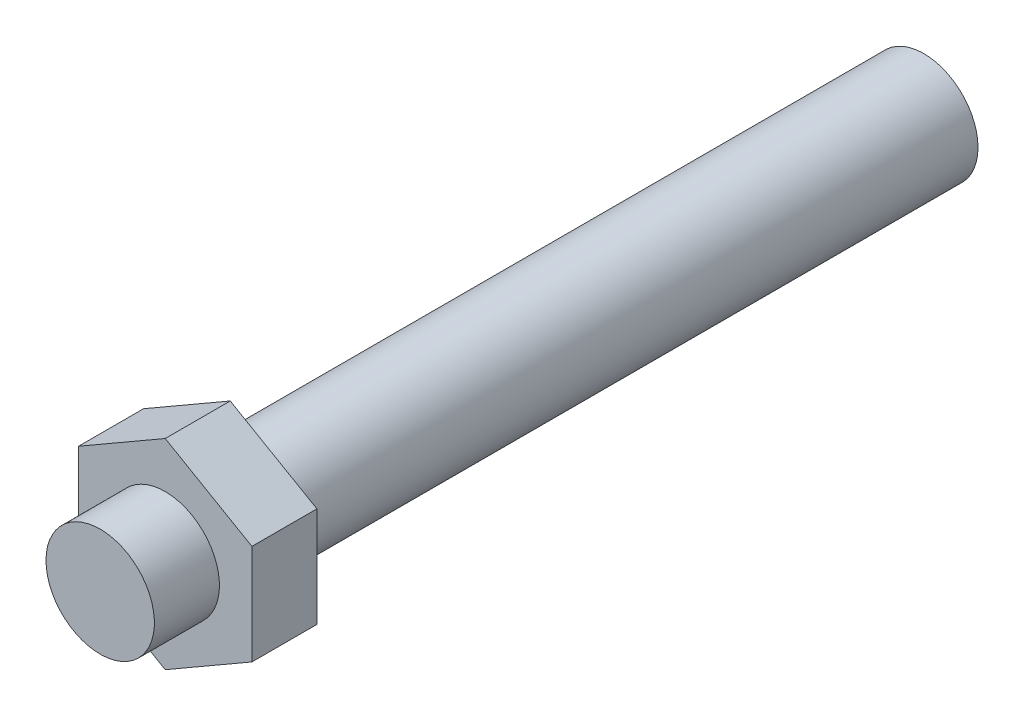
ISO-10303-21;
HEADER;
FILE_DESCRIPTION(('STEP AP214'),'2;1');
FILE_NAME('part.step','',(''),(''),'','','');
FILE_SCHEMA(('AUTOMOTIVE_DESIGN { 1 0 10303 214 1 1 1 1 }'));
ENDSEC;
DATA;
#1=APPLICATION_CONTEXT('core data for automotive mechanical design processes');
#2=APPLICATION_PROTOCOL_DEFINITION('international standard','automotive_design',2000,#1);
#3=PRODUCT_CONTEXT('',#1,'mechanical');
#4=PRODUCT('Part','Part','',(#3));
#5=PRODUCT_RELATED_PRODUCT_CATEGORY('part','',(#4));
#6=PRODUCT_DEFINITION_FORMATION('','',#4);
#7=PRODUCT_DEFINITION_CONTEXT('part definition',#1,'design');
#8=PRODUCT_DEFINITION('design','',#6,#7);
#9=PRODUCT_DEFINITION_SHAPE('','',#8);
#10=(LENGTH_UNIT() NAMED_UNIT(*) SI_UNIT(.MILLI.,.METRE.));
#11=(NAMED_UNIT(*) PLANE_ANGLE_UNIT() SI_UNIT($,.RADIAN.));
#12=(NAMED_UNIT(*) SI_UNIT($,.STERADIAN.) SOLID_ANGLE_UNIT());
#13=UNCERTAINTY_MEASURE_WITH_UNIT(LENGTH_MEASURE(1.E-05),#10,'distance_accuracy_value','');
#14=(GEOMETRIC_REPRESENTATION_CONTEXT(3) GLOBAL_UNCERTAINTY_ASSIGNED_CONTEXT((#13)) GLOBAL_UNIT_ASSIGNED_CONTEXT((#10,
#11,#12)) REPRESENTATION_CONTEXT('',''));
#15=CARTESIAN_POINT('',(0.,0.,0.));
#16=DIRECTION('',(0.,0.,1.));
#17=DIRECTION('',(1.,0.,0.));
#18=AXIS2_PLACEMENT_3D('',#15,#16,#17);
#19=CARTESIAN_POINT('',(12.7,-7.33234841870825,111.125));
#20=DIRECTION('',(0.,0.,1.));
#21=DIRECTION('',(1.,0.,0.));
#22=AXIS2_PLACEMENT_3D('',#19,#20,#21);
#23=PLANE('',#22);
#24=DIRECTION('',(0.866025403784439,0.5,0.));
#25=VECTOR('',#24,1.);
#26=CARTESIAN_POINT('',(0.,-14.6646968374165,111.125));
#27=LINE('',#26,#25);
#28=CARTESIAN_POINT('',(0.,-14.6646968374165,111.125));
#29=VERTEX_POINT('',#28);
#30=CARTESIAN_POINT('',(12.7,-7.33234841870825,111.125));
#31=VERTEX_POINT('',#30);
#32=EDGE_CURVE('E125',#29,#31,#27,.T.);
#33=ORIENTED_EDGE('',*,*,#32,.T.);
#34=DIRECTION('',(0.,1.,0.));
#35=VECTOR('',#34,1.);
#36=CARTESIAN_POINT('',(12.7,-7.33234841870825,111.125));
#37=LINE('',#36,#35);
#38=CARTESIAN_POINT('',(12.7,7.33234841870825,111.125));
#39=VERTEX_POINT('',#38);
#40=EDGE_CURVE('E103',#31,#39,#37,.T.);
#41=ORIENTED_EDGE('',*,*,#40,.T.);
#42=DIRECTION('',(-0.866025403784439,0.5,0.));
#43=VECTOR('',#42,1.);
#44=CARTESIAN_POINT('',(12.7,7.33234841870825,111.125));
#45=LINE('',#44,#43);
#46=CARTESIAN_POINT('',(0.,14.6646968374165,111.125));
#47=VERTEX_POINT('',#46);
#48=EDGE_CURVE('E128',#39,#47,#45,.T.);
#49=ORIENTED_EDGE('',*,*,#48,.T.);
#50=DIRECTION('',(-0.866025403784438,-0.5,0.));
#51=VECTOR('',#50,1.);
#52=CARTESIAN_POINT('',(0.,14.6646968374165,111.125));
#53=LINE('',#52,#51);
#54=CARTESIAN_POINT('',(-12.7,7.33234841870825,111.125));
#55=VERTEX_POINT('',#54);
#56=EDGE_CURVE('E130',#47,#55,#53,.T.);
#57=ORIENTED_EDGE('',*,*,#56,.T.);
#58=DIRECTION('',(0.,-1.,0.));
#59=VECTOR('',#58,1.);
#60=CARTESIAN_POINT('',(-12.7,7.33234841870825,111.125));
#61=LINE('',#60,#59);
#62=CARTESIAN_POINT('',(-12.7,-7.33234841870825,111.125));
#63=VERTEX_POINT('',#62);
#64=EDGE_CURVE('E54',#55,#63,#61,.T.);
#65=ORIENTED_EDGE('',*,*,#64,.T.);
#66=DIRECTION('',(0.866025403784439,-0.5,0.));
#67=VECTOR('',#66,1.);
#68=CARTESIAN_POINT('',(-12.7,-7.33234841870825,111.125));
#69=LINE('',#68,#67);
#70=EDGE_CURVE('E49',#63,#29,#69,.T.);
#71=ORIENTED_EDGE('',*,*,#70,.T.);
#72=EDGE_LOOP('',(#33,#41,#49,#57,#65,#71));
#73=FACE_BOUND('',#72,.T.);
#74=CARTESIAN_POINT('',(0.,0.,111.125));
#75=DIRECTION('',(0.,0.,1.));
#76=DIRECTION('',(1.,0.,0.));
#77=AXIS2_PLACEMENT_3D('',#74,#75,#76);
#78=CIRCLE('',#77,7.9375);
#79=CARTESIAN_POINT('',(-7.9375,0.,111.125));
#80=VERTEX_POINT('',#79);
#81=EDGE_CURVE('E114',#80,#80,#78,.T.);
#82=ORIENTED_EDGE('',*,*,#81,.F.);
#83=EDGE_LOOP('',(#82));
#84=FACE_BOUND('',#83,.T.);
#85=ADVANCED_FACE('F34',(#73,#84),#23,.T.);
#86=CARTESIAN_POINT('',(0.,0.,101.6));
#87=DIRECTION('',(0.,0.,-1.));
#88=DIRECTION('',(-1.,0.,0.));
#89=AXIS2_PLACEMENT_3D('',#86,#87,#88);
#90=CYLINDRICAL_SURFACE('',#89,7.9375);
#91=CARTESIAN_POINT('',(0.,0.,101.6));
#92=DIRECTION('',(0.,0.,1.));
#93=DIRECTION('',(1.,0.,0.));
#94=AXIS2_PLACEMENT_3D('',#91,#92,#93);
#95=CIRCLE('',#94,7.9375);
#96=CARTESIAN_POINT('',(7.9375,0.,101.6));
#97=VERTEX_POINT('',#96);
#98=EDGE_CURVE('E12',#97,#97,#95,.T.);
#99=ORIENTED_EDGE('',*,*,#98,.F.);
#100=EDGE_LOOP('',(#99));
#101=FACE_BOUND('',#100,.T.);
#102=CARTESIAN_POINT('',(0.,0.,0.));
#103=DIRECTION('',(0.,0.,1.));
#104=DIRECTION('',(1.,0.,0.));
#105=AXIS2_PLACEMENT_3D('',#102,#103,#104);
#106=CIRCLE('',#105,7.9375);
#107=CARTESIAN_POINT('',(7.9375,0.,0.));
#108=VERTEX_POINT('',#107);
#109=EDGE_CURVE('E42',#108,#108,#106,.T.);
#110=ORIENTED_EDGE('',*,*,#109,.T.);
#111=EDGE_LOOP('',(#110));
#112=FACE_BOUND('',#111,.T.);
#113=ADVANCED_FACE('F36',(#101,#112),#90,.T.);
#114=CARTESIAN_POINT('',(0.,0.,0.));
#115=DIRECTION('',(0.,0.,1.));
#116=DIRECTION('',(1.,0.,0.));
#117=AXIS2_PLACEMENT_3D('',#114,#115,#116);
#118=PLANE('',#117);
#119=ORIENTED_EDGE('',*,*,#109,.F.);
#120=EDGE_LOOP('',(#119));
#121=FACE_BOUND('',#120,.T.);
#122=ADVANCED_FACE('F148',(#121),#118,.F.);
#123=CARTESIAN_POINT('',(12.7,-7.33234841870825,101.6));
#124=DIRECTION('',(0.,0.,1.));
#125=DIRECTION('',(1.,0.,0.));
#126=AXIS2_PLACEMENT_3D('',#123,#124,#125);
#127=PLANE('',#126);
#128=DIRECTION('',(0.866025403784439,0.5,0.));
#129=VECTOR('',#128,1.);
#130=CARTESIAN_POINT('',(0.,-14.6646968374165,101.6));
#131=LINE('',#130,#129);
#132=CARTESIAN_POINT('',(0.,-14.6646968374165,101.6));
#133=VERTEX_POINT('',#132);
#134=CARTESIAN_POINT('',(12.7,-7.33234841870825,101.6));
#135=VERTEX_POINT('',#134);
#136=EDGE_CURVE('E93',#133,#135,#131,.T.);
#137=ORIENTED_EDGE('',*,*,#136,.F.);
#138=DIRECTION('',(0.866025403784439,-0.5,0.));
#139=VECTOR('',#138,1.);
#140=CARTESIAN_POINT('',(-12.7,-7.33234841870825,101.6));
#141=LINE('',#140,#139);
#142=CARTESIAN_POINT('',(-12.7,-7.33234841870825,101.6));
#143=VERTEX_POINT('',#142);
#144=EDGE_CURVE('E123',#143,#133,#141,.T.);
#145=ORIENTED_EDGE('',*,*,#144,.F.);
#146=DIRECTION('',(0.,-1.,0.));
#147=VECTOR('',#146,1.);
#148=CARTESIAN_POINT('',(-12.7,7.33234841870825,101.6));
#149=LINE('',#148,#147);
#150=CARTESIAN_POINT('',(-12.7,7.33234841870825,101.6));
#151=VERTEX_POINT('',#150);
#152=EDGE_CURVE('E121',#151,#143,#149,.T.);
#153=ORIENTED_EDGE('',*,*,#152,.F.);
#154=DIRECTION('',(-0.866025403784438,-0.5,0.));
#155=VECTOR('',#154,1.);
#156=CARTESIAN_POINT('',(0.,14.6646968374165,101.6));
#157=LINE('',#156,#155);
#158=CARTESIAN_POINT('',(0.,14.6646968374165,101.6));
#159=VERTEX_POINT('',#158);
#160=EDGE_CURVE('E119',#159,#151,#157,.T.);
#161=ORIENTED_EDGE('',*,*,#160,.F.);
#162=DIRECTION('',(-0.866025403784439,0.5,0.));
#163=VECTOR('',#162,1.);
#164=CARTESIAN_POINT('',(12.7,7.33234841870825,101.6));
#165=LINE('',#164,#163);
#166=CARTESIAN_POINT('',(12.7,7.33234841870825,101.6));
#167=VERTEX_POINT('',#166);
#168=EDGE_CURVE('E95',#167,#159,#165,.T.);
#169=ORIENTED_EDGE('',*,*,#168,.F.);
#170=DIRECTION('',(0.,1.,0.));
#171=VECTOR('',#170,1.);
#172=CARTESIAN_POINT('',(12.7,-7.33234841870825,101.6));
#173=LINE('',#172,#171);
#174=EDGE_CURVE('E87',#135,#167,#173,.T.);
#175=ORIENTED_EDGE('',*,*,#174,.F.);
#176=EDGE_LOOP('',(#137,#145,#153,#161,#169,#175));
#177=FACE_BOUND('',#176,.T.);
#178=ORIENTED_EDGE('',*,*,#98,.T.);
#179=EDGE_LOOP('',(#178));
#180=FACE_BOUND('',#179,.T.);
#181=ADVANCED_FACE('F89',(#177,#180),#127,.F.);
#182=CARTESIAN_POINT('',(0.,-14.6646968374165,111.125));
#183=DIRECTION('',(-0.5,0.866025403784439,0.));
#184=DIRECTION('',(-0.866025403784439,-0.5,0.));
#185=AXIS2_PLACEMENT_3D('',#182,#183,#184);
#186=PLANE('',#185);
#187=ORIENTED_EDGE('',*,*,#136,.T.);
#188=DIRECTION('',(0.,0.,-1.));
#189=VECTOR('',#188,1.);
#190=CARTESIAN_POINT('',(12.7,-7.33234841870825,111.125));
#191=LINE('',#190,#189);
#192=EDGE_CURVE('E101',#31,#135,#191,.T.);
#193=ORIENTED_EDGE('',*,*,#192,.F.);
#194=ORIENTED_EDGE('',*,*,#32,.F.);
#195=DIRECTION('',(0.,0.,-1.));
#196=VECTOR('',#195,1.);
#197=CARTESIAN_POINT('',(0.,-14.6646968374165,111.125));
#198=LINE('',#197,#196);
#199=EDGE_CURVE('E110',#29,#133,#198,.T.);
#200=ORIENTED_EDGE('',*,*,#199,.T.);
#201=EDGE_LOOP('',(#187,#193,#194,#200));
#202=FACE_BOUND('',#201,.T.);
#203=ADVANCED_FACE('F109',(#202),#186,.F.);
#204=CARTESIAN_POINT('',(12.7,-7.33234841870825,111.125));
#205=DIRECTION('',(-1.,0.,0.));
#206=DIRECTION('',(0.,-1.,0.));
#207=AXIS2_PLACEMENT_3D('',#204,#205,#206);
#208=PLANE('',#207);
#209=ORIENTED_EDGE('',*,*,#174,.T.);
#210=DIRECTION('',(0.,0.,-1.));
#211=VECTOR('',#210,1.);
#212=CARTESIAN_POINT('',(12.7,7.33234841870825,111.125));
#213=LINE('',#212,#211);
#214=EDGE_CURVE('E106',#39,#167,#213,.T.);
#215=ORIENTED_EDGE('',*,*,#214,.F.);
#216=ORIENTED_EDGE('',*,*,#40,.F.);
#217=ORIENTED_EDGE('',*,*,#192,.T.);
#218=EDGE_LOOP('',(#209,#215,#216,#217));
#219=FACE_BOUND('',#218,.T.);
#220=ADVANCED_FACE('F102',(#219),#208,.F.);
#221=CARTESIAN_POINT('',(12.7,7.33234841870825,111.125));
#222=DIRECTION('',(-0.5,-0.866025403784439,0.));
#223=DIRECTION('',(0.866025403784439,-0.5,0.));
#224=AXIS2_PLACEMENT_3D('',#221,#222,#223);
#225=PLANE('',#224);
#226=ORIENTED_EDGE('',*,*,#168,.T.);
#227=DIRECTION('',(0.,0.,-1.));
#228=VECTOR('',#227,1.);
#229=CARTESIAN_POINT('',(0.,14.6646968374165,111.125));
#230=LINE('',#229,#228);
#231=EDGE_CURVE('E141',#47,#159,#230,.T.);
#232=ORIENTED_EDGE('',*,*,#231,.F.);
#233=ORIENTED_EDGE('',*,*,#48,.F.);
#234=ORIENTED_EDGE('',*,*,#214,.T.);
#235=EDGE_LOOP('',(#226,#232,#233,#234));
#236=FACE_BOUND('',#235,.T.);
#237=ADVANCED_FACE('F176',(#236),#225,.F.);
#238=CARTESIAN_POINT('',(0.,14.6646968374165,111.125));
#239=DIRECTION('',(0.5,-0.866025403784439,0.));
#240=DIRECTION('',(0.866025403784438,0.5,0.));
#241=AXIS2_PLACEMENT_3D('',#238,#239,#240);
#242=PLANE('',#241);
#243=ORIENTED_EDGE('',*,*,#160,.T.);
#244=DIRECTION('',(0.,0.,-1.));
#245=VECTOR('',#244,1.);
#246=CARTESIAN_POINT('',(-12.7,7.33234841870825,111.125));
#247=LINE('',#246,#245);
#248=EDGE_CURVE('E138',#55,#151,#247,.T.);
#249=ORIENTED_EDGE('',*,*,#248,.F.);
#250=ORIENTED_EDGE('',*,*,#56,.F.);
#251=ORIENTED_EDGE('',*,*,#231,.T.);
#252=EDGE_LOOP('',(#243,#249,#250,#251));
#253=FACE_BOUND('',#252,.T.);
#254=ADVANCED_FACE('F172',(#253),#242,.F.);
#255=CARTESIAN_POINT('',(-12.7,7.33234841870825,111.125));
#256=DIRECTION('',(1.,0.,0.));
#257=DIRECTION('',(0.,1.,0.));
#258=AXIS2_PLACEMENT_3D('',#255,#256,#257);
#259=PLANE('',#258);
#260=ORIENTED_EDGE('',*,*,#152,.T.);
#261=DIRECTION('',(0.,0.,-1.));
#262=VECTOR('',#261,1.);
#263=CARTESIAN_POINT('',(-12.7,-7.33234841870825,111.125));
#264=LINE('',#263,#262);
#265=EDGE_CURVE('E135',#63,#143,#264,.T.);
#266=ORIENTED_EDGE('',*,*,#265,.F.);
#267=ORIENTED_EDGE('',*,*,#64,.F.);
#268=ORIENTED_EDGE('',*,*,#248,.T.);
#269=EDGE_LOOP('',(#260,#266,#267,#268));
#270=FACE_BOUND('',#269,.T.);
#271=ADVANCED_FACE('F168',(#270),#259,.F.);
#272=CARTESIAN_POINT('',(-12.7,-7.33234841870825,111.125));
#273=DIRECTION('',(0.5,0.866025403784439,0.));
#274=DIRECTION('',(-0.866025403784439,0.5,0.));
#275=AXIS2_PLACEMENT_3D('',#272,#273,#274);
#276=PLANE('',#275);
#277=ORIENTED_EDGE('',*,*,#144,.T.);
#278=ORIENTED_EDGE('',*,*,#199,.F.);
#279=ORIENTED_EDGE('',*,*,#70,.F.);
#280=ORIENTED_EDGE('',*,*,#265,.T.);
#281=EDGE_LOOP('',(#277,#278,#279,#280));
#282=FACE_BOUND('',#281,.T.);
#283=ADVANCED_FACE('F164',(#282),#276,.F.);
#284=CARTESIAN_POINT('',(0.,0.,120.65));
#285=DIRECTION('',(0.,0.,-1.));
#286=DIRECTION('',(-1.,0.,0.));
#287=AXIS2_PLACEMENT_3D('',#284,#285,#286);
#288=CYLINDRICAL_SURFACE('',#287,7.9375);
#289=CARTESIAN_POINT('',(0.,0.,120.65));
#290=DIRECTION('',(0.,0.,1.));
#291=DIRECTION('',(1.,0.,0.));
#292=AXIS2_PLACEMENT_3D('',#289,#290,#291);
#293=CIRCLE('',#292,7.9375);
#294=CARTESIAN_POINT('',(-7.9375,0.,120.65));
#295=VERTEX_POINT('',#294);
#296=EDGE_CURVE('E111',#295,#295,#293,.T.);
#297=CARTESIAN_POINT('',(-7.9375,0.,120.65));
#298=CARTESIAN_POINT('',(-7.9375,0.,120.55078125));
#299=CARTESIAN_POINT('',(-7.9375,0.,120.4515625));
#300=CARTESIAN_POINT('',(-7.9375,0.,120.253125));
#301=CARTESIAN_POINT('',(-7.9375,0.,120.15390625));
#302=CARTESIAN_POINT('',(-7.9375,0.,119.95546875));
#303=CARTESIAN_POINT('',(-7.9375,0.,119.85625));
#304=CARTESIAN_POINT('',(-7.9375,0.,119.6578125));
#305=CARTESIAN_POINT('',(-7.9375,0.,119.55859375));
#306=CARTESIAN_POINT('',(-7.9375,0.,119.36015625));
#307=CARTESIAN_POINT('',(-7.9375,0.,119.2609375));
#308=CARTESIAN_POINT('',(-7.9375,0.,119.0625));
#309=CARTESIAN_POINT('',(-7.9375,0.,118.96328125));
#310=CARTESIAN_POINT('',(-7.9375,0.,118.76484375));
#311=CARTESIAN_POINT('',(-7.9375,0.,118.665625));
#312=CARTESIAN_POINT('',(-7.9375,0.,118.4671875));
#313=CARTESIAN_POINT('',(-7.9375,0.,118.36796875));
#314=CARTESIAN_POINT('',(-7.9375,0.,118.16953125));
#315=CARTESIAN_POINT('',(-7.9375,0.,118.0703125));
#316=CARTESIAN_POINT('',(-7.9375,0.,117.871875));
#317=CARTESIAN_POINT('',(-7.9375,0.,117.77265625));
#318=CARTESIAN_POINT('',(-7.9375,0.,117.57421875));
#319=CARTESIAN_POINT('',(-7.9375,0.,117.475));
#320=CARTESIAN_POINT('',(-7.9375,0.,117.2765625));
#321=CARTESIAN_POINT('',(-7.9375,0.,117.17734375));
#322=CARTESIAN_POINT('',(-7.9375,0.,116.97890625));
#323=CARTESIAN_POINT('',(-7.9375,0.,116.8796875));
#324=CARTESIAN_POINT('',(-7.9375,0.,116.68125));
#325=CARTESIAN_POINT('',(-7.9375,0.,116.58203125));
#326=CARTESIAN_POINT('',(-7.9375,0.,116.38359375));
#327=CARTESIAN_POINT('',(-7.9375,0.,116.284375));
#328=CARTESIAN_POINT('',(-7.9375,0.,116.0859375));
#329=CARTESIAN_POINT('',(-7.9375,0.,115.98671875));
#330=CARTESIAN_POINT('',(-7.9375,0.,115.78828125));
#331=CARTESIAN_POINT('',(-7.9375,0.,115.6890625));
#332=CARTESIAN_POINT('',(-7.9375,0.,115.490625));
#333=CARTESIAN_POINT('',(-7.9375,0.,115.39140625));
#334=CARTESIAN_POINT('',(-7.9375,0.,115.19296875));
#335=CARTESIAN_POINT('',(-7.9375,0.,115.09375));
#336=CARTESIAN_POINT('',(-7.9375,0.,114.8953125));
#337=CARTESIAN_POINT('',(-7.9375,0.,114.79609375));
#338=CARTESIAN_POINT('',(-7.9375,0.,114.59765625));
#339=CARTESIAN_POINT('',(-7.9375,0.,114.4984375));
#340=CARTESIAN_POINT('',(-7.9375,0.,114.3));
#341=CARTESIAN_POINT('',(-7.9375,0.,114.20078125));
#342=CARTESIAN_POINT('',(-7.9375,0.,114.00234375));
#343=CARTESIAN_POINT('',(-7.9375,0.,113.903125));
#344=CARTESIAN_POINT('',(-7.9375,0.,113.7046875));
#345=CARTESIAN_POINT('',(-7.9375,0.,113.60546875));
#346=CARTESIAN_POINT('',(-7.9375,0.,113.40703125));
#347=CARTESIAN_POINT('',(-7.9375,0.,113.3078125));
#348=CARTESIAN_POINT('',(-7.9375,0.,113.109375));
#349=CARTESIAN_POINT('',(-7.9375,0.,113.01015625));
#350=CARTESIAN_POINT('',(-7.9375,0.,112.81171875));
#351=CARTESIAN_POINT('',(-7.9375,0.,112.7125));
#352=CARTESIAN_POINT('',(-7.9375,0.,112.5140625));
#353=CARTESIAN_POINT('',(-7.9375,0.,112.41484375));
#354=CARTESIAN_POINT('',(-7.9375,0.,112.21640625));
#355=CARTESIAN_POINT('',(-7.9375,0.,112.1171875));
#356=CARTESIAN_POINT('',(-7.9375,0.,111.91875));
#357=CARTESIAN_POINT('',(-7.9375,0.,111.81953125));
#358=CARTESIAN_POINT('',(-7.9375,0.,111.62109375));
#359=CARTESIAN_POINT('',(-7.9375,0.,111.521875));
#360=CARTESIAN_POINT('',(-7.9375,0.,111.3234375));
#361=CARTESIAN_POINT('',(-7.9375,0.,111.22421875));
#362=CARTESIAN_POINT('',(-7.9375,0.,111.125));
#363=B_SPLINE_CURVE_WITH_KNOTS('',3,(#297,#298,#299,#300,#301,#302,#303,#304,#305,#306,#307,
#308,#309,#310,#311,#312,#313,#314,#315,#316,#317,#318,#319,#320,#321,#322,#323,#324,#325,#326,
#327,#328,#329,#330,#331,#332,#333,#334,#335,#336,#337,#338,#339,#340,#341,#342,#343,#344,#345,
#346,#347,#348,#349,#350,#351,#352,#353,#354,#355,#356,#357,#358,#359,#360,#361,#362),
.UNSPECIFIED.,.F.,.F.,(4,2,2,2,2,2,2,2,2,2,2,2,2,2,2,2,2,2,2,2,2,2,2,2,2,2,2,2,2,2,2,2,4),(0.,
0.29765625,0.5953125,0.892968750000001,1.190625,1.48828125,1.7859375,2.08359375,2.38125,
2.67890625,2.9765625,3.27421875,3.571875,3.86953125,4.1671875,4.46484375,4.7625,5.06015625,
5.3578125,5.65546875,5.953125,6.25078125,6.5484375,6.84609375,7.14375,7.44140625,7.7390625,
8.03671875000001,8.334375,8.63203125,8.92968750000001,9.22734375000001,9.52500000000001),.UNSPECIFIED.);
#364=EDGE_CURVE('BSEAM167',#295,#80,#363,.T.);
#365=ORIENTED_EDGE('',*,*,#296,.F.);
#366=ORIENTED_EDGE('',*,*,#81,.T.);
#367=ORIENTED_EDGE('',*,*,#364,.T.);
#368=ORIENTED_EDGE('',*,*,#364,.F.);
#369=EDGE_LOOP('',(#365,#367,#366,#368));
#370=FACE_BOUND('',#369,.T.);
#371=ADVANCED_FACE('F167',(#370),#288,.T.);
#372=CARTESIAN_POINT('',(0.,0.,120.65));
#373=DIRECTION('',(0.,0.,1.));
#374=DIRECTION('',(1.,0.,0.));
#375=AXIS2_PLACEMENT_3D('',#372,#373,#374);
#376=PLANE('',#375);
#377=ORIENTED_EDGE('',*,*,#296,.T.);
#378=EDGE_LOOP('',(#377));
#379=FACE_BOUND('',#378,.T.);
#380=ADVANCED_FACE('F213',(#379),#376,.T.);
#381=CLOSED_SHELL('',(#85,#113,#122,#181,#203,#220,#237,#254,#271,#283,#371,#380));
#382=MANIFOLD_SOLID_BREP('B2',#381);
#383=ADVANCED_BREP_SHAPE_REPRESENTATION('',(#18,#382),#14);
#384=SHAPE_DEFINITION_REPRESENTATION(#9,#383);
ENDSEC;
END-ISO-10303-21;
